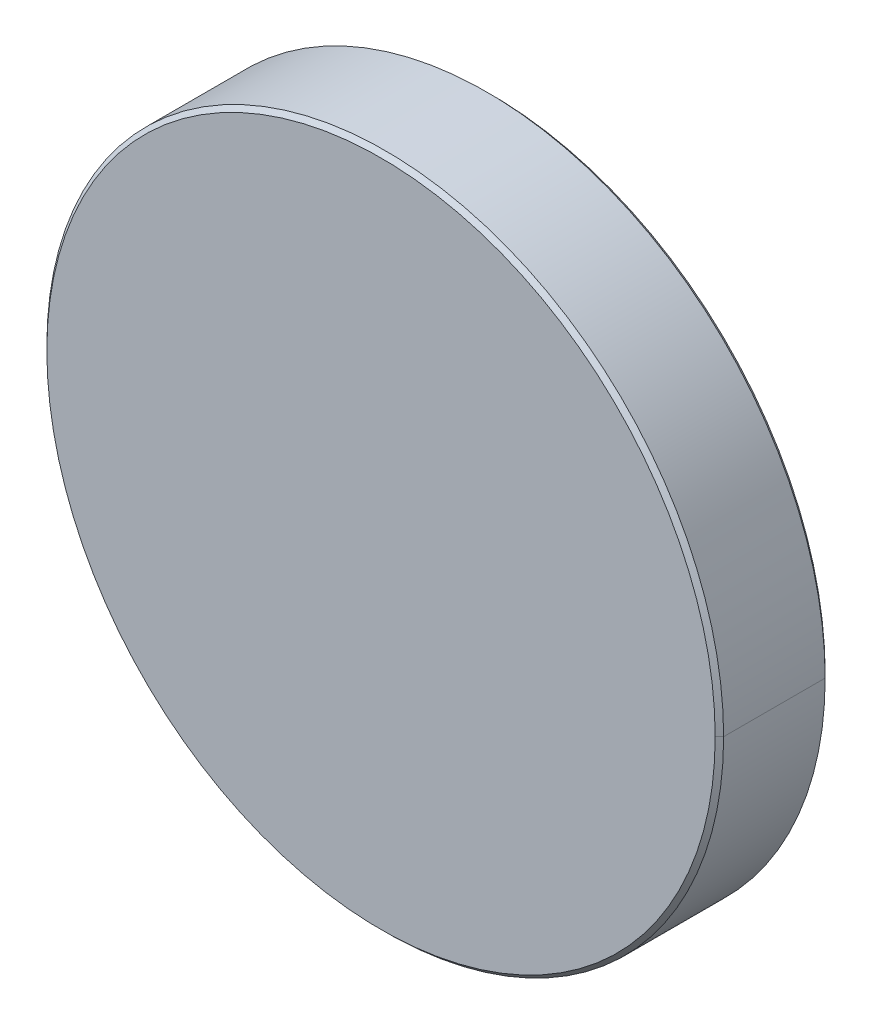
ISO-10303-21;
HEADER;
FILE_DESCRIPTION(('STEP AP214'),'2;1');
FILE_NAME('part.step','',(''),(''),'','','');
FILE_SCHEMA(('AUTOMOTIVE_DESIGN { 1 0 10303 214 1 1 1 1 }'));
ENDSEC;
DATA;
#1=APPLICATION_CONTEXT('core data for automotive mechanical design processes');
#2=APPLICATION_PROTOCOL_DEFINITION('international standard','automotive_design',2000,#1);
#3=PRODUCT_CONTEXT('',#1,'mechanical');
#4=PRODUCT('Part','Part','',(#3));
#5=PRODUCT_RELATED_PRODUCT_CATEGORY('part','',(#4));
#6=PRODUCT_DEFINITION_FORMATION('','',#4);
#7=PRODUCT_DEFINITION_CONTEXT('part definition',#1,'design');
#8=PRODUCT_DEFINITION('design','',#6,#7);
#9=PRODUCT_DEFINITION_SHAPE('','',#8);
#10=(LENGTH_UNIT() NAMED_UNIT(*) SI_UNIT(.MILLI.,.METRE.));
#11=(NAMED_UNIT(*) PLANE_ANGLE_UNIT() SI_UNIT($,.RADIAN.));
#12=(NAMED_UNIT(*) SI_UNIT($,.STERADIAN.) SOLID_ANGLE_UNIT());
#13=UNCERTAINTY_MEASURE_WITH_UNIT(LENGTH_MEASURE(1.E-05),#10,'distance_accuracy_value','');
#14=(GEOMETRIC_REPRESENTATION_CONTEXT(3) GLOBAL_UNCERTAINTY_ASSIGNED_CONTEXT((#13)) GLOBAL_UNIT_ASSIGNED_CONTEXT((#10,
#11,#12)) REPRESENTATION_CONTEXT('',''));
#15=CARTESIAN_POINT('',(0.,0.,0.));
#16=DIRECTION('',(0.,0.,1.));
#17=DIRECTION('',(1.,0.,0.));
#18=AXIS2_PLACEMENT_3D('',#15,#16,#17);
#19=CARTESIAN_POINT('',(0.,0.,5.2));
#20=DIRECTION('',(0.,0.,-1.));
#21=DIRECTION('',(-1.,0.,0.));
#22=AXIS2_PLACEMENT_3D('',#19,#20,#21);
#23=CONICAL_SURFACE('',#22,15.8,0.785398163397448);
#24=CARTESIAN_POINT('',(0.,0.,5.2));
#25=DIRECTION('',(0.,0.,1.));
#26=DIRECTION('',(1.,0.,0.));
#27=AXIS2_PLACEMENT_3D('',#24,#25,#26);
#28=CIRCLE('',#27,15.8);
#29=CARTESIAN_POINT('',(15.8,0.,5.2));
#30=VERTEX_POINT('',#29);
#31=CARTESIAN_POINT('',(-15.8,0.,5.2));
#32=VERTEX_POINT('',#31);
#33=EDGE_CURVE('E36',#30,#32,#28,.T.);
#34=ORIENTED_EDGE('',*,*,#33,.F.);
#35=DIRECTION('',(0.707106781186548,0.,-0.707106781186548));
#36=VECTOR('',#35,1.);
#37=CARTESIAN_POINT('',(15.8,0.,5.2));
#38=LINE('',#37,#36);
#39=CARTESIAN_POINT('',(16.,0.,5.));
#40=VERTEX_POINT('',#39);
#41=EDGE_CURVE('E11',#30,#40,#38,.T.);
#42=ORIENTED_EDGE('',*,*,#41,.T.);
#43=CARTESIAN_POINT('',(0.,0.,5.));
#44=DIRECTION('',(0.,0.,-1.));
#45=DIRECTION('',(1.,0.,0.));
#46=AXIS2_PLACEMENT_3D('',#43,#44,#45);
#47=CIRCLE('',#46,16.);
#48=CARTESIAN_POINT('',(-16.,0.,5.));
#49=VERTEX_POINT('',#48);
#50=EDGE_CURVE('E100',#49,#40,#47,.T.);
#51=ORIENTED_EDGE('',*,*,#50,.F.);
#52=DIRECTION('',(-0.707106781186548,0.,-0.707106781186548));
#53=VECTOR('',#52,1.);
#54=CARTESIAN_POINT('',(-15.8,0.,5.2));
#55=LINE('',#54,#53);
#56=EDGE_CURVE('E84',#32,#49,#55,.T.);
#57=ORIENTED_EDGE('',*,*,#56,.F.);
#58=EDGE_LOOP('',(#34,#42,#51,#57));
#59=FACE_BOUND('',#58,.T.);
#60=ADVANCED_FACE('F16',(#59),#23,.T.);
#61=CARTESIAN_POINT('',(0.,0.,0.199999999999996));
#62=DIRECTION('',(0.,0.,1.));
#63=DIRECTION('',(1.,0.,0.));
#64=AXIS2_PLACEMENT_3D('',#61,#62,#63);
#65=CONICAL_SURFACE('',#64,16.,0.785398163397457);
#66=CARTESIAN_POINT('',(0.,0.,0.));
#67=DIRECTION('',(0.,0.,-1.));
#68=DIRECTION('',(1.,0.,0.));
#69=AXIS2_PLACEMENT_3D('',#66,#67,#68);
#70=CIRCLE('',#69,15.8);
#71=CARTESIAN_POINT('',(-15.8,0.,0.));
#72=VERTEX_POINT('',#71);
#73=CARTESIAN_POINT('',(15.8,0.,0.));
#74=VERTEX_POINT('',#73);
#75=EDGE_CURVE('E89',#72,#74,#70,.T.);
#76=ORIENTED_EDGE('',*,*,#75,.F.);
#77=DIRECTION('',(-0.707106781186554,0.,0.707106781186542));
#78=VECTOR('',#77,1.);
#79=CARTESIAN_POINT('',(-16.,0.,0.199999999999996));
#80=LINE('',#79,#78);
#81=CARTESIAN_POINT('',(-16.,0.,0.199999999999996));
#82=VERTEX_POINT('',#81);
#83=EDGE_CURVE('E24',#72,#82,#80,.T.);
#84=ORIENTED_EDGE('',*,*,#83,.T.);
#85=CARTESIAN_POINT('',(0.,0.,0.199999999999996));
#86=DIRECTION('',(0.,0.,1.));
#87=DIRECTION('',(1.,0.,0.));
#88=AXIS2_PLACEMENT_3D('',#85,#86,#87);
#89=CIRCLE('',#88,16.);
#90=CARTESIAN_POINT('',(16.,0.,0.199999999999996));
#91=VERTEX_POINT('',#90);
#92=EDGE_CURVE('E116',#91,#82,#89,.T.);
#93=ORIENTED_EDGE('',*,*,#92,.F.);
#94=DIRECTION('',(0.707106781186554,0.,0.707106781186542));
#95=VECTOR('',#94,1.);
#96=CARTESIAN_POINT('',(16.,0.,0.199999999999996));
#97=LINE('',#96,#95);
#98=EDGE_CURVE('E66',#74,#91,#97,.T.);
#99=ORIENTED_EDGE('',*,*,#98,.F.);
#100=EDGE_LOOP('',(#76,#84,#93,#99));
#101=FACE_BOUND('',#100,.T.);
#102=ADVANCED_FACE('F91',(#101),#65,.T.);
#103=CARTESIAN_POINT('',(0.,0.,5.2));
#104=DIRECTION('',(0.,0.,-1.));
#105=DIRECTION('',(-1.,0.,0.));
#106=AXIS2_PLACEMENT_3D('',#103,#104,#105);
#107=CYLINDRICAL_SURFACE('',#106,16.);
#108=ORIENTED_EDGE('',*,*,#50,.T.);
#109=DIRECTION('',(0.,0.,-1.));
#110=VECTOR('',#109,1.);
#111=CARTESIAN_POINT('',(16.,0.,5.2));
#112=LINE('',#111,#110);
#113=EDGE_CURVE('E49',#40,#91,#112,.T.);
#114=ORIENTED_EDGE('',*,*,#113,.T.);
#115=ORIENTED_EDGE('',*,*,#92,.T.);
#116=DIRECTION('',(0.,0.,-1.));
#117=VECTOR('',#116,1.);
#118=CARTESIAN_POINT('',(-16.,0.,5.2));
#119=LINE('',#118,#117);
#120=EDGE_CURVE('E123',#49,#82,#119,.T.);
#121=ORIENTED_EDGE('',*,*,#120,.F.);
#122=EDGE_LOOP('',(#108,#114,#115,#121));
#123=FACE_BOUND('',#122,.T.);
#124=ADVANCED_FACE('F140',(#123),#107,.T.);
#125=CARTESIAN_POINT('',(0.,0.,5.2));
#126=DIRECTION('',(0.,0.,-1.));
#127=DIRECTION('',(-1.,0.,0.));
#128=AXIS2_PLACEMENT_3D('',#125,#126,#127);
#129=CYLINDRICAL_SURFACE('',#128,16.);
#130=ORIENTED_EDGE('',*,*,#113,.F.);
#131=CARTESIAN_POINT('',(0.,0.,5.));
#132=DIRECTION('',(0.,0.,-1.));
#133=DIRECTION('',(1.,0.,0.));
#134=AXIS2_PLACEMENT_3D('',#131,#132,#133);
#135=CIRCLE('',#134,16.);
#136=EDGE_CURVE('E120',#40,#49,#135,.T.);
#137=ORIENTED_EDGE('',*,*,#136,.T.);
#138=ORIENTED_EDGE('',*,*,#120,.T.);
#139=CARTESIAN_POINT('',(0.,0.,0.199999999999996));
#140=DIRECTION('',(0.,0.,1.));
#141=DIRECTION('',(1.,0.,0.));
#142=AXIS2_PLACEMENT_3D('',#139,#140,#141);
#143=CIRCLE('',#142,16.);
#144=EDGE_CURVE('E98',#82,#91,#143,.T.);
#145=ORIENTED_EDGE('',*,*,#144,.T.);
#146=EDGE_LOOP('',(#130,#137,#138,#145));
#147=FACE_BOUND('',#146,.T.);
#148=ADVANCED_FACE('F145',(#147),#129,.T.);
#149=CARTESIAN_POINT('',(0.,0.,5.2));
#150=DIRECTION('',(0.,0.,1.));
#151=DIRECTION('',(1.,0.,0.));
#152=AXIS2_PLACEMENT_3D('',#149,#150,#151);
#153=PLANE('',#152);
#154=CARTESIAN_POINT('',(0.,0.,5.2));
#155=DIRECTION('',(0.,0.,1.));
#156=DIRECTION('',(1.,0.,0.));
#157=AXIS2_PLACEMENT_3D('',#154,#155,#156);
#158=CIRCLE('',#157,15.8);
#159=EDGE_CURVE('E110',#32,#30,#158,.T.);
#160=ORIENTED_EDGE('',*,*,#159,.T.);
#161=ORIENTED_EDGE('',*,*,#33,.T.);
#162=EDGE_LOOP('',(#160,#161));
#163=FACE_BOUND('',#162,.T.);
#164=ADVANCED_FACE('F147',(#163),#153,.T.);
#165=CARTESIAN_POINT('',(0.,0.,0.));
#166=DIRECTION('',(0.,0.,1.));
#167=DIRECTION('',(1.,0.,0.));
#168=AXIS2_PLACEMENT_3D('',#165,#166,#167);
#169=PLANE('',#168);
#170=CARTESIAN_POINT('',(0.,0.,0.));
#171=DIRECTION('',(0.,0.,-1.));
#172=DIRECTION('',(1.,0.,0.));
#173=AXIS2_PLACEMENT_3D('',#170,#171,#172);
#174=CIRCLE('',#173,15.8);
#175=EDGE_CURVE('E95',#74,#72,#174,.T.);
#176=ORIENTED_EDGE('',*,*,#175,.T.);
#177=ORIENTED_EDGE('',*,*,#75,.T.);
#178=EDGE_LOOP('',(#176,#177));
#179=FACE_BOUND('',#178,.T.);
#180=ADVANCED_FACE('F102',(#179),#169,.F.);
#181=CARTESIAN_POINT('',(0.,0.,0.199999999999996));
#182=DIRECTION('',(0.,0.,1.));
#183=DIRECTION('',(1.,0.,0.));
#184=AXIS2_PLACEMENT_3D('',#181,#182,#183);
#185=CONICAL_SURFACE('',#184,16.,0.785398163397457);
#186=ORIENTED_EDGE('',*,*,#83,.F.);
#187=ORIENTED_EDGE('',*,*,#175,.F.);
#188=ORIENTED_EDGE('',*,*,#98,.T.);
#189=ORIENTED_EDGE('',*,*,#144,.F.);
#190=EDGE_LOOP('',(#186,#187,#188,#189));
#191=FACE_BOUND('',#190,.T.);
#192=ADVANCED_FACE('F97',(#191),#185,.T.);
#193=CARTESIAN_POINT('',(0.,0.,5.2));
#194=DIRECTION('',(0.,0.,-1.));
#195=DIRECTION('',(-1.,0.,0.));
#196=AXIS2_PLACEMENT_3D('',#193,#194,#195);
#197=CONICAL_SURFACE('',#196,15.8,0.785398163397448);
#198=ORIENTED_EDGE('',*,*,#41,.F.);
#199=ORIENTED_EDGE('',*,*,#159,.F.);
#200=ORIENTED_EDGE('',*,*,#56,.T.);
#201=ORIENTED_EDGE('',*,*,#136,.F.);
#202=EDGE_LOOP('',(#198,#199,#200,#201));
#203=FACE_BOUND('',#202,.T.);
#204=ADVANCED_FACE('F144',(#203),#197,.T.);
#205=CLOSED_SHELL('',(#60,#102,#124,#148,#164,#180,#192,#204));
#206=MANIFOLD_SOLID_BREP('B1',#205);
#207=ADVANCED_BREP_SHAPE_REPRESENTATION('',(#18,#206),#14);
#208=SHAPE_DEFINITION_REPRESENTATION(#9,#207);
ENDSEC;
END-ISO-10303-21;
